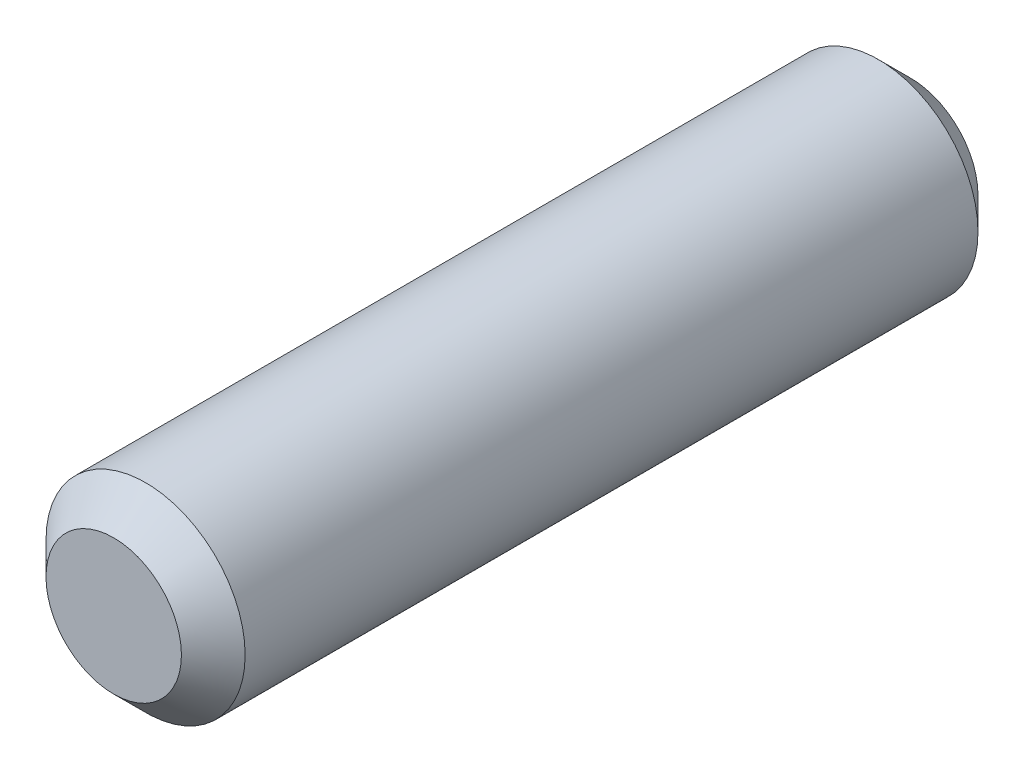
ISO-10303-21;
HEADER;
FILE_DESCRIPTION(('STEP AP214'),'2;1');
FILE_NAME('part.step','',(''),(''),'','','');
FILE_SCHEMA(('AUTOMOTIVE_DESIGN { 1 0 10303 214 1 1 1 1 }'));
ENDSEC;
DATA;
#1=APPLICATION_CONTEXT('core data for automotive mechanical design processes');
#2=APPLICATION_PROTOCOL_DEFINITION('international standard','automotive_design',2000,#1);
#3=PRODUCT_CONTEXT('',#1,'mechanical');
#4=PRODUCT('Part','Part','',(#3));
#5=PRODUCT_RELATED_PRODUCT_CATEGORY('part','',(#4));
#6=PRODUCT_DEFINITION_FORMATION('','',#4);
#7=PRODUCT_DEFINITION_CONTEXT('part definition',#1,'design');
#8=PRODUCT_DEFINITION('design','',#6,#7);
#9=PRODUCT_DEFINITION_SHAPE('','',#8);
#10=(LENGTH_UNIT() NAMED_UNIT(*) SI_UNIT(.MILLI.,.METRE.));
#11=(NAMED_UNIT(*) PLANE_ANGLE_UNIT() SI_UNIT($,.RADIAN.));
#12=(NAMED_UNIT(*) SI_UNIT($,.STERADIAN.) SOLID_ANGLE_UNIT());
#13=UNCERTAINTY_MEASURE_WITH_UNIT(LENGTH_MEASURE(1.E-05),#10,'distance_accuracy_value','');
#14=(GEOMETRIC_REPRESENTATION_CONTEXT(3) GLOBAL_UNCERTAINTY_ASSIGNED_CONTEXT((#13)) GLOBAL_UNIT_ASSIGNED_CONTEXT((#10,
#11,#12)) REPRESENTATION_CONTEXT('',''));
#15=CARTESIAN_POINT('',(0.,0.,0.));
#16=DIRECTION('',(0.,0.,1.));
#17=DIRECTION('',(1.,0.,0.));
#18=AXIS2_PLACEMENT_3D('',#15,#16,#17);
#19=CARTESIAN_POINT('',(0.,0.,4.7625));
#20=DIRECTION('',(0.,0.,-1.));
#21=DIRECTION('',(-1.,0.,0.));
#22=AXIS2_PLACEMENT_3D('',#19,#20,#21);
#23=CYLINDRICAL_SURFACE('',#22,1.190625);
#24=CARTESIAN_POINT('',(0.,0.,-4.38149999999999));
#25=DIRECTION('',(0.,0.,1.));
#26=DIRECTION('',(1.,0.,0.));
#27=AXIS2_PLACEMENT_3D('',#24,#25,#26);
#28=CIRCLE('',#27,1.190625);
#29=CARTESIAN_POINT('',(-1.190625,0.,-4.38149999999999));
#30=VERTEX_POINT('',#29);
#31=EDGE_CURVE('E51',#30,#30,#28,.T.);
#32=CARTESIAN_POINT('',(0.,0.,4.3815));
#33=DIRECTION('',(0.,0.,1.));
#34=DIRECTION('',(1.,0.,0.));
#35=AXIS2_PLACEMENT_3D('',#32,#33,#34);
#36=CIRCLE('',#35,1.190625);
#37=CARTESIAN_POINT('',(-1.190625,0.,4.3815));
#38=VERTEX_POINT('',#37);
#39=EDGE_CURVE('E55',#38,#38,#36,.F.);
#40=CARTESIAN_POINT('',(-1.190625,0.,-4.38149999999999));
#41=CARTESIAN_POINT('',(-1.190625,0.,-4.29021874999999));
#42=CARTESIAN_POINT('',(-1.190625,0.,-4.19893749999999));
#43=CARTESIAN_POINT('',(-1.190625,0.,-4.01637499999999));
#44=CARTESIAN_POINT('',(-1.190625,0.,-3.92509374999999));
#45=CARTESIAN_POINT('',(-1.190625,0.,-3.74253124999999));
#46=CARTESIAN_POINT('',(-1.190625,0.,-3.65124999999999));
#47=CARTESIAN_POINT('',(-1.190625,0.,-3.46868749999999));
#48=CARTESIAN_POINT('',(-1.190625,0.,-3.37740624999999));
#49=CARTESIAN_POINT('',(-1.190625,0.,-3.19484375));
#50=CARTESIAN_POINT('',(-1.190625,0.,-3.10356249999999));
#51=CARTESIAN_POINT('',(-1.190625,0.,-2.921));
#52=CARTESIAN_POINT('',(-1.190625,0.,-2.82971875));
#53=CARTESIAN_POINT('',(-1.190625,0.,-2.64715625));
#54=CARTESIAN_POINT('',(-1.190625,0.,-2.555875));
#55=CARTESIAN_POINT('',(-1.190625,0.,-2.3733125));
#56=CARTESIAN_POINT('',(-1.190625,0.,-2.28203124999999));
#57=CARTESIAN_POINT('',(-1.190625,0.,-2.09946874999999));
#58=CARTESIAN_POINT('',(-1.190625,0.,-2.0081875));
#59=CARTESIAN_POINT('',(-1.190625,0.,-1.825625));
#60=CARTESIAN_POINT('',(-1.190625,0.,-1.73434375));
#61=CARTESIAN_POINT('',(-1.190625,0.,-1.55178125));
#62=CARTESIAN_POINT('',(-1.190625,0.,-1.4605));
#63=CARTESIAN_POINT('',(-1.190625,0.,-1.2779375));
#64=CARTESIAN_POINT('',(-1.190625,0.,-1.18665625));
#65=CARTESIAN_POINT('',(-1.190625,0.,-1.00409375));
#66=CARTESIAN_POINT('',(-1.190625,0.,-0.912812499999995));
#67=CARTESIAN_POINT('',(-1.190625,0.,-0.730249999999995));
#68=CARTESIAN_POINT('',(-1.190625,0.,-0.638968749999996));
#69=CARTESIAN_POINT('',(-1.190625,0.,-0.456406249999996));
#70=CARTESIAN_POINT('',(-1.190625,0.,-0.365124999999996));
#71=CARTESIAN_POINT('',(-1.190625,0.,-0.182562499999995));
#72=CARTESIAN_POINT('',(-1.190625,0.,-0.0912812499999956));
#73=CARTESIAN_POINT('',(-1.190625,0.,0.0912812500000043));
#74=CARTESIAN_POINT('',(-1.190625,0.,0.182562500000004));
#75=CARTESIAN_POINT('',(-1.190625,0.,0.365125000000004));
#76=CARTESIAN_POINT('',(-1.190625,0.,0.456406250000004));
#77=CARTESIAN_POINT('',(-1.190625,0.,0.638968750000004));
#78=CARTESIAN_POINT('',(-1.190625,0.,0.730250000000004));
#79=CARTESIAN_POINT('',(-1.190625,0.,0.912812500000004));
#80=CARTESIAN_POINT('',(-1.190625,0.,1.00409375));
#81=CARTESIAN_POINT('',(-1.190625,0.,1.18665625));
#82=CARTESIAN_POINT('',(-1.190625,0.,1.2779375));
#83=CARTESIAN_POINT('',(-1.190625,0.,1.4605));
#84=CARTESIAN_POINT('',(-1.190625,0.,1.55178125));
#85=CARTESIAN_POINT('',(-1.190625,0.,1.73434375));
#86=CARTESIAN_POINT('',(-1.190625,0.,1.825625));
#87=CARTESIAN_POINT('',(-1.190625,0.,2.0081875));
#88=CARTESIAN_POINT('',(-1.190625,0.,2.09946875));
#89=CARTESIAN_POINT('',(-1.190625,0.,2.28203125));
#90=CARTESIAN_POINT('',(-1.190625,0.,2.3733125));
#91=CARTESIAN_POINT('',(-1.190625,0.,2.555875));
#92=CARTESIAN_POINT('',(-1.190625,0.,2.64715625));
#93=CARTESIAN_POINT('',(-1.190625,0.,2.82971875));
#94=CARTESIAN_POINT('',(-1.190625,0.,2.921));
#95=CARTESIAN_POINT('',(-1.190625,0.,3.1035625));
#96=CARTESIAN_POINT('',(-1.190625,0.,3.19484375));
#97=CARTESIAN_POINT('',(-1.190625,0.,3.37740625));
#98=CARTESIAN_POINT('',(-1.190625,0.,3.4686875));
#99=CARTESIAN_POINT('',(-1.190625,0.,3.65125));
#100=CARTESIAN_POINT('',(-1.190625,0.,3.74253125));
#101=CARTESIAN_POINT('',(-1.190625,0.,3.92509375));
#102=CARTESIAN_POINT('',(-1.190625,0.,4.016375));
#103=CARTESIAN_POINT('',(-1.190625,0.,4.1989375));
#104=CARTESIAN_POINT('',(-1.190625,0.,4.29021875));
#105=CARTESIAN_POINT('',(-1.190625,0.,4.3815));
#106=B_SPLINE_CURVE_WITH_KNOTS('',3,(#40,#41,#42,#43,#44,#45,#46,#47,#48,#49,#50,#51,#52,#53,
#54,#55,#56,#57,#58,#59,#60,#61,#62,#63,#64,#65,#66,#67,#68,#69,#70,#71,#72,#73,#74,#75,#76,#77,
#78,#79,#80,#81,#82,#83,#84,#85,#86,#87,#88,#89,#90,#91,#92,#93,#94,#95,#96,#97,#98,#99,#100,
#101,#102,#103,#104,#105),.UNSPECIFIED.,.F.,.F.,(4,2,2,2,2,2,2,2,2,2,2,2,2,2,2,2,2,2,2,2,2,2,2,
2,2,2,2,2,2,2,2,2,4),(0.,0.273843750000001,0.5476875,0.82153125,1.095375,1.36921875,1.6430625,
1.91690625,2.19075,2.46459375,2.7384375,3.01228125,3.286125,3.55996875,3.8338125,4.10765625,
4.3815,4.65534375,4.9291875,5.20303125,5.476875,5.75071875,6.0245625,6.29840625,6.57225,
6.84609375,7.1199375,7.39378125,7.667625,7.94146875,8.2153125,8.48915625,8.763),.UNSPECIFIED.);
#107=EDGE_CURVE('BSEAM39',#30,#38,#106,.T.);
#108=ORIENTED_EDGE('',*,*,#31,.T.);
#109=ORIENTED_EDGE('',*,*,#39,.T.);
#110=ORIENTED_EDGE('',*,*,#107,.T.);
#111=ORIENTED_EDGE('',*,*,#107,.F.);
#112=EDGE_LOOP('',(#108,#110,#109,#111));
#113=FACE_BOUND('',#112,.T.);
#114=ADVANCED_FACE('F39',(#113),#23,.T.);
#115=CARTESIAN_POINT('',(0.,0.,4.7625));
#116=DIRECTION('',(0.,0.,1.));
#117=DIRECTION('',(1.,0.,0.));
#118=AXIS2_PLACEMENT_3D('',#115,#116,#117);
#119=PLANE('',#118);
#120=CARTESIAN_POINT('',(0.,0.,4.7625));
#121=DIRECTION('',(0.,0.,1.));
#122=DIRECTION('',(1.,0.,0.));
#123=AXIS2_PLACEMENT_3D('',#120,#121,#122);
#124=CIRCLE('',#123,0.809625000000003);
#125=CARTESIAN_POINT('',(0.809625000000003,0.,4.7625));
#126=VERTEX_POINT('',#125);
#127=EDGE_CURVE('E10',#126,#126,#124,.T.);
#128=ORIENTED_EDGE('',*,*,#127,.T.);
#129=EDGE_LOOP('',(#128));
#130=FACE_BOUND('',#129,.T.);
#131=ADVANCED_FACE('F71',(#130),#119,.T.);
#132=CARTESIAN_POINT('',(0.,0.,-4.7625));
#133=DIRECTION('',(0.,0.,1.));
#134=DIRECTION('',(1.,0.,0.));
#135=AXIS2_PLACEMENT_3D('',#132,#133,#134);
#136=PLANE('',#135);
#137=CARTESIAN_POINT('',(0.,0.,-4.7625));
#138=DIRECTION('',(0.,0.,1.));
#139=DIRECTION('',(1.,0.,0.));
#140=AXIS2_PLACEMENT_3D('',#137,#138,#139);
#141=CIRCLE('',#140,0.809624999999991);
#142=CARTESIAN_POINT('',(0.809624999999991,0.,-4.7625));
#143=VERTEX_POINT('',#142);
#144=EDGE_CURVE('E47',#143,#143,#141,.F.);
#145=ORIENTED_EDGE('',*,*,#144,.T.);
#146=EDGE_LOOP('',(#145));
#147=FACE_BOUND('',#146,.T.);
#148=ADVANCED_FACE('F68',(#147),#136,.F.);
#149=CARTESIAN_POINT('',(0.,0.,-4.38149999999999));
#150=DIRECTION('',(0.,0.,1.));
#151=DIRECTION('',(1.,0.,0.));
#152=AXIS2_PLACEMENT_3D('',#149,#150,#151);
#153=CONICAL_SURFACE('',#152,1.190625,0.78539816339745);
#154=ORIENTED_EDGE('',*,*,#144,.F.);
#155=EDGE_LOOP('',(#154));
#156=FACE_BOUND('',#155,.T.);
#157=ORIENTED_EDGE('',*,*,#31,.F.);
#158=EDGE_LOOP('',(#157));
#159=FACE_BOUND('',#158,.T.);
#160=ADVANCED_FACE('F64',(#156,#159),#153,.T.);
#161=CARTESIAN_POINT('',(0.,0.,4.7625));
#162=DIRECTION('',(0.,0.,-1.));
#163=DIRECTION('',(-1.,0.,0.));
#164=AXIS2_PLACEMENT_3D('',#161,#162,#163);
#165=CONICAL_SURFACE('',#164,0.809625000000003,0.785398163397448);
#166=ORIENTED_EDGE('',*,*,#39,.F.);
#167=EDGE_LOOP('',(#166));
#168=FACE_BOUND('',#167,.T.);
#169=ORIENTED_EDGE('',*,*,#127,.F.);
#170=EDGE_LOOP('',(#169));
#171=FACE_BOUND('',#170,.T.);
#172=ADVANCED_FACE('F42',(#168,#171),#165,.T.);
#173=CLOSED_SHELL('',(#114,#131,#148,#160,#172));
#174=MANIFOLD_SOLID_BREP('B2',#173);
#175=ADVANCED_BREP_SHAPE_REPRESENTATION('',(#18,#174),#14);
#176=SHAPE_DEFINITION_REPRESENTATION(#9,#175);
ENDSEC;
END-ISO-10303-21;
